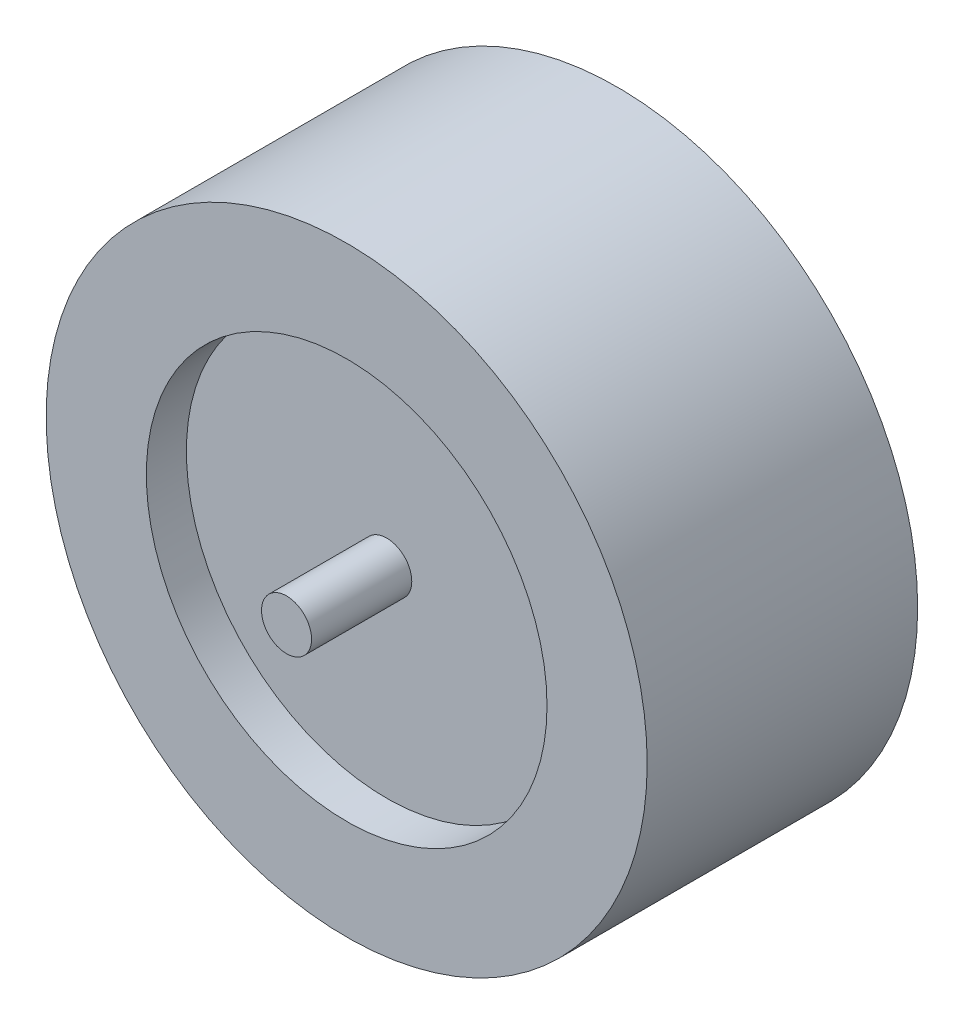
ISO-10303-21;
HEADER;
FILE_DESCRIPTION(('STEP AP214'),'2;1');
FILE_NAME('part.step','',(''),(''),'','','');
FILE_SCHEMA(('AUTOMOTIVE_DESIGN { 1 0 10303 214 1 1 1 1 }'));
ENDSEC;
DATA;
#1=APPLICATION_CONTEXT('core data for automotive mechanical design processes');
#2=APPLICATION_PROTOCOL_DEFINITION('international standard','automotive_design',2000,#1);
#3=PRODUCT_CONTEXT('',#1,'mechanical');
#4=PRODUCT('Part','Part','',(#3));
#5=PRODUCT_RELATED_PRODUCT_CATEGORY('part','',(#4));
#6=PRODUCT_DEFINITION_FORMATION('','',#4);
#7=PRODUCT_DEFINITION_CONTEXT('part definition',#1,'design');
#8=PRODUCT_DEFINITION('design','',#6,#7);
#9=PRODUCT_DEFINITION_SHAPE('','',#8);
#10=(LENGTH_UNIT() NAMED_UNIT(*) SI_UNIT(.MILLI.,.METRE.));
#11=(NAMED_UNIT(*) PLANE_ANGLE_UNIT() SI_UNIT($,.RADIAN.));
#12=(NAMED_UNIT(*) SI_UNIT($,.STERADIAN.) SOLID_ANGLE_UNIT());
#13=UNCERTAINTY_MEASURE_WITH_UNIT(LENGTH_MEASURE(1.E-05),#10,'distance_accuracy_value','');
#14=(GEOMETRIC_REPRESENTATION_CONTEXT(3) GLOBAL_UNCERTAINTY_ASSIGNED_CONTEXT((#13)) GLOBAL_UNIT_ASSIGNED_CONTEXT((#10,
#11,#12)) REPRESENTATION_CONTEXT('',''));
#15=CARTESIAN_POINT('',(0.,0.,0.));
#16=DIRECTION('',(0.,0.,1.));
#17=DIRECTION('',(1.,0.,0.));
#18=AXIS2_PLACEMENT_3D('',#15,#16,#17);
#19=CARTESIAN_POINT('',(0.,0.,27.));
#20=DIRECTION('',(0.,0.,-1.));
#21=DIRECTION('',(-1.,0.,0.));
#22=AXIS2_PLACEMENT_3D('',#19,#20,#21);
#23=CYLINDRICAL_SURFACE('',#22,30.);
#24=CARTESIAN_POINT('',(0.,0.,27.));
#25=DIRECTION('',(0.,0.,1.));
#26=DIRECTION('',(1.,0.,0.));
#27=AXIS2_PLACEMENT_3D('',#24,#25,#26);
#28=CIRCLE('',#27,30.);
#29=CARTESIAN_POINT('',(30.,0.,27.));
#30=VERTEX_POINT('',#29);
#31=EDGE_CURVE('E42',#30,#30,#28,.T.);
#32=ORIENTED_EDGE('',*,*,#31,.F.);
#33=EDGE_LOOP('',(#32));
#34=FACE_BOUND('',#33,.T.);
#35=CARTESIAN_POINT('',(0.,0.,0.));
#36=DIRECTION('',(0.,0.,1.));
#37=DIRECTION('',(1.,0.,0.));
#38=AXIS2_PLACEMENT_3D('',#35,#36,#37);
#39=CIRCLE('',#38,30.);
#40=CARTESIAN_POINT('',(30.,0.,0.));
#41=VERTEX_POINT('',#40);
#42=EDGE_CURVE('E57',#41,#41,#39,.T.);
#43=ORIENTED_EDGE('',*,*,#42,.T.);
#44=EDGE_LOOP('',(#43));
#45=FACE_BOUND('',#44,.T.);
#46=ADVANCED_FACE('F31',(#34,#45),#23,.T.);
#47=CARTESIAN_POINT('',(0.,0.,27.));
#48=DIRECTION('',(0.,0.,1.));
#49=DIRECTION('',(1.,0.,0.));
#50=AXIS2_PLACEMENT_3D('',#47,#48,#49);
#51=PLANE('',#50);
#52=CARTESIAN_POINT('',(0.,0.,27.));
#53=DIRECTION('',(0.,0.,1.));
#54=DIRECTION('',(1.,0.,0.));
#55=AXIS2_PLACEMENT_3D('',#52,#53,#54);
#56=CIRCLE('',#55,20.);
#57=CARTESIAN_POINT('',(20.,0.,27.));
#58=VERTEX_POINT('',#57);
#59=EDGE_CURVE('E50',#58,#58,#56,.T.);
#60=ORIENTED_EDGE('',*,*,#59,.F.);
#61=EDGE_LOOP('',(#60));
#62=FACE_BOUND('',#61,.T.);
#63=ORIENTED_EDGE('',*,*,#31,.T.);
#64=EDGE_LOOP('',(#63));
#65=FACE_BOUND('',#64,.T.);
#66=ADVANCED_FACE('F68',(#62,#65),#51,.T.);
#67=CARTESIAN_POINT('',(0.,0.,0.));
#68=DIRECTION('',(0.,0.,1.));
#69=DIRECTION('',(1.,0.,0.));
#70=AXIS2_PLACEMENT_3D('',#67,#68,#69);
#71=PLANE('',#70);
#72=CARTESIAN_POINT('',(0.,0.,0.));
#73=DIRECTION('',(0.,0.,-1.));
#74=DIRECTION('',(-1.,0.,0.));
#75=AXIS2_PLACEMENT_3D('',#72,#73,#74);
#76=CIRCLE('',#75,20.);
#77=CARTESIAN_POINT('',(-20.,0.,0.));
#78=VERTEX_POINT('',#77);
#79=EDGE_CURVE('E51',#78,#78,#76,.T.);
#80=ORIENTED_EDGE('',*,*,#79,.F.);
#81=EDGE_LOOP('',(#80));
#82=FACE_BOUND('',#81,.T.);
#83=ORIENTED_EDGE('',*,*,#42,.F.);
#84=EDGE_LOOP('',(#83));
#85=FACE_BOUND('',#84,.T.);
#86=ADVANCED_FACE('F65',(#82,#85),#71,.F.);
#87=CARTESIAN_POINT('',(0.,0.,23.));
#88=DIRECTION('',(0.,0.,1.));
#89=DIRECTION('',(1.,0.,0.));
#90=AXIS2_PLACEMENT_3D('',#87,#88,#89);
#91=CYLINDRICAL_SURFACE('',#90,20.);
#92=CARTESIAN_POINT('',(0.,0.,23.));
#93=DIRECTION('',(0.,0.,1.));
#94=DIRECTION('',(1.,0.,0.));
#95=AXIS2_PLACEMENT_3D('',#92,#93,#94);
#96=CIRCLE('',#95,20.);
#97=CARTESIAN_POINT('',(20.,0.,23.));
#98=VERTEX_POINT('',#97);
#99=EDGE_CURVE('E54',#98,#98,#96,.T.);
#100=ORIENTED_EDGE('',*,*,#99,.F.);
#101=EDGE_LOOP('',(#100));
#102=FACE_BOUND('',#101,.T.);
#103=ORIENTED_EDGE('',*,*,#59,.T.);
#104=EDGE_LOOP('',(#103));
#105=FACE_BOUND('',#104,.T.);
#106=ADVANCED_FACE('F67',(#102,#105),#91,.F.);
#107=CARTESIAN_POINT('',(0.,0.,23.));
#108=DIRECTION('',(0.,0.,1.));
#109=DIRECTION('',(1.,0.,0.));
#110=AXIS2_PLACEMENT_3D('',#107,#108,#109);
#111=PLANE('',#110);
#112=CARTESIAN_POINT('',(0.,0.,23.));
#113=DIRECTION('',(0.,0.,1.));
#114=DIRECTION('',(1.,0.,0.));
#115=AXIS2_PLACEMENT_3D('',#112,#113,#114);
#116=CIRCLE('',#115,2.5);
#117=CARTESIAN_POINT('',(2.5,0.,23.));
#118=VERTEX_POINT('',#117);
#119=EDGE_CURVE('E10',#118,#118,#116,.T.);
#120=ORIENTED_EDGE('',*,*,#119,.F.);
#121=EDGE_LOOP('',(#120));
#122=FACE_BOUND('',#121,.T.);
#123=ORIENTED_EDGE('',*,*,#99,.T.);
#124=EDGE_LOOP('',(#123));
#125=FACE_BOUND('',#124,.T.);
#126=ADVANCED_FACE('F74',(#122,#125),#111,.T.);
#127=CARTESIAN_POINT('',(0.,0.,4.));
#128=DIRECTION('',(0.,0.,-1.));
#129=DIRECTION('',(-1.,0.,0.));
#130=AXIS2_PLACEMENT_3D('',#127,#128,#129);
#131=CYLINDRICAL_SURFACE('',#130,20.);
#132=CARTESIAN_POINT('',(0.,0.,4.));
#133=DIRECTION('',(0.,0.,-1.));
#134=DIRECTION('',(-1.,0.,0.));
#135=AXIS2_PLACEMENT_3D('',#132,#133,#134);
#136=CIRCLE('',#135,20.);
#137=CARTESIAN_POINT('',(-20.,0.,4.));
#138=VERTEX_POINT('',#137);
#139=EDGE_CURVE('E47',#138,#138,#136,.T.);
#140=ORIENTED_EDGE('',*,*,#139,.F.);
#141=EDGE_LOOP('',(#140));
#142=FACE_BOUND('',#141,.T.);
#143=ORIENTED_EDGE('',*,*,#79,.T.);
#144=EDGE_LOOP('',(#143));
#145=FACE_BOUND('',#144,.T.);
#146=ADVANCED_FACE('F107',(#142,#145),#131,.F.);
#147=CARTESIAN_POINT('',(0.,0.,4.));
#148=DIRECTION('',(0.,0.,-1.));
#149=DIRECTION('',(-1.,0.,0.));
#150=AXIS2_PLACEMENT_3D('',#147,#148,#149);
#151=PLANE('',#150);
#152=CARTESIAN_POINT('',(0.,0.,4.));
#153=DIRECTION('',(0.,0.,-1.));
#154=DIRECTION('',(-1.,0.,0.));
#155=AXIS2_PLACEMENT_3D('',#152,#153,#154);
#156=CIRCLE('',#155,2.5);
#157=CARTESIAN_POINT('',(-2.5,0.,4.));
#158=VERTEX_POINT('',#157);
#159=EDGE_CURVE('E34',#158,#158,#156,.T.);
#160=ORIENTED_EDGE('',*,*,#159,.F.);
#161=EDGE_LOOP('',(#160));
#162=FACE_BOUND('',#161,.T.);
#163=ORIENTED_EDGE('',*,*,#139,.T.);
#164=EDGE_LOOP('',(#163));
#165=FACE_BOUND('',#164,.T.);
#166=ADVANCED_FACE('F112',(#162,#165),#151,.T.);
#167=CARTESIAN_POINT('',(0.,0.,-7.));
#168=DIRECTION('',(0.,0.,1.));
#169=DIRECTION('',(1.,0.,0.));
#170=AXIS2_PLACEMENT_3D('',#167,#168,#169);
#171=PLANE('',#170);
#172=CARTESIAN_POINT('',(0.,0.,-7.));
#173=DIRECTION('',(0.,0.,1.));
#174=DIRECTION('',(1.,0.,0.));
#175=AXIS2_PLACEMENT_3D('',#172,#173,#174);
#176=CIRCLE('',#175,2.5);
#177=CARTESIAN_POINT('',(2.5,0.,-7.));
#178=VERTEX_POINT('',#177);
#179=EDGE_CURVE('E45',#178,#178,#176,.T.);
#180=ORIENTED_EDGE('',*,*,#179,.F.);
#181=EDGE_LOOP('',(#180));
#182=FACE_BOUND('',#181,.T.);
#183=ADVANCED_FACE('F129',(#182),#171,.F.);
#184=CARTESIAN_POINT('',(0.,0.,-7.));
#185=DIRECTION('',(0.,0.,1.));
#186=DIRECTION('',(1.,0.,0.));
#187=AXIS2_PLACEMENT_3D('',#184,#185,#186);
#188=CYLINDRICAL_SURFACE('',#187,2.5);
#189=ORIENTED_EDGE('',*,*,#159,.T.);
#190=EDGE_LOOP('',(#189));
#191=FACE_BOUND('',#190,.T.);
#192=ORIENTED_EDGE('',*,*,#179,.T.);
#193=EDGE_LOOP('',(#192));
#194=FACE_BOUND('',#193,.T.);
#195=ADVANCED_FACE('F139',(#191,#194),#188,.T.);
#196=ORIENTED_EDGE('',*,*,#119,.T.);
#197=EDGE_LOOP('',(#196));
#198=FACE_BOUND('',#197,.T.);
#199=CARTESIAN_POINT('',(0.,0.,33.));
#200=DIRECTION('',(0.,0.,1.));
#201=DIRECTION('',(1.,0.,0.));
#202=AXIS2_PLACEMENT_3D('',#199,#200,#201);
#203=CIRCLE('',#202,2.5);
#204=CARTESIAN_POINT('',(2.5,0.,33.));
#205=VERTEX_POINT('',#204);
#206=EDGE_CURVE('E173',#205,#205,#203,.T.);
#207=ORIENTED_EDGE('',*,*,#206,.F.);
#208=EDGE_LOOP('',(#207));
#209=FACE_BOUND('',#208,.T.);
#210=ADVANCED_FACE('F149',(#198,#209),#188,.T.);
#211=CARTESIAN_POINT('',(0.,0.,33.));
#212=DIRECTION('',(0.,0.,1.));
#213=DIRECTION('',(1.,0.,0.));
#214=AXIS2_PLACEMENT_3D('',#211,#212,#213);
#215=PLANE('',#214);
#216=ORIENTED_EDGE('',*,*,#206,.T.);
#217=EDGE_LOOP('',(#216));
#218=FACE_BOUND('',#217,.T.);
#219=ADVANCED_FACE('F159',(#218),#215,.T.);
#220=CLOSED_SHELL('',(#46,#66,#86,#106,#126,#146,#166,#183,#195,#210,#219));
#221=MANIFOLD_SOLID_BREP('B2',#220);
#222=ADVANCED_BREP_SHAPE_REPRESENTATION('',(#18,#221),#14);
#223=SHAPE_DEFINITION_REPRESENTATION(#9,#222);
ENDSEC;
END-ISO-10303-21;
